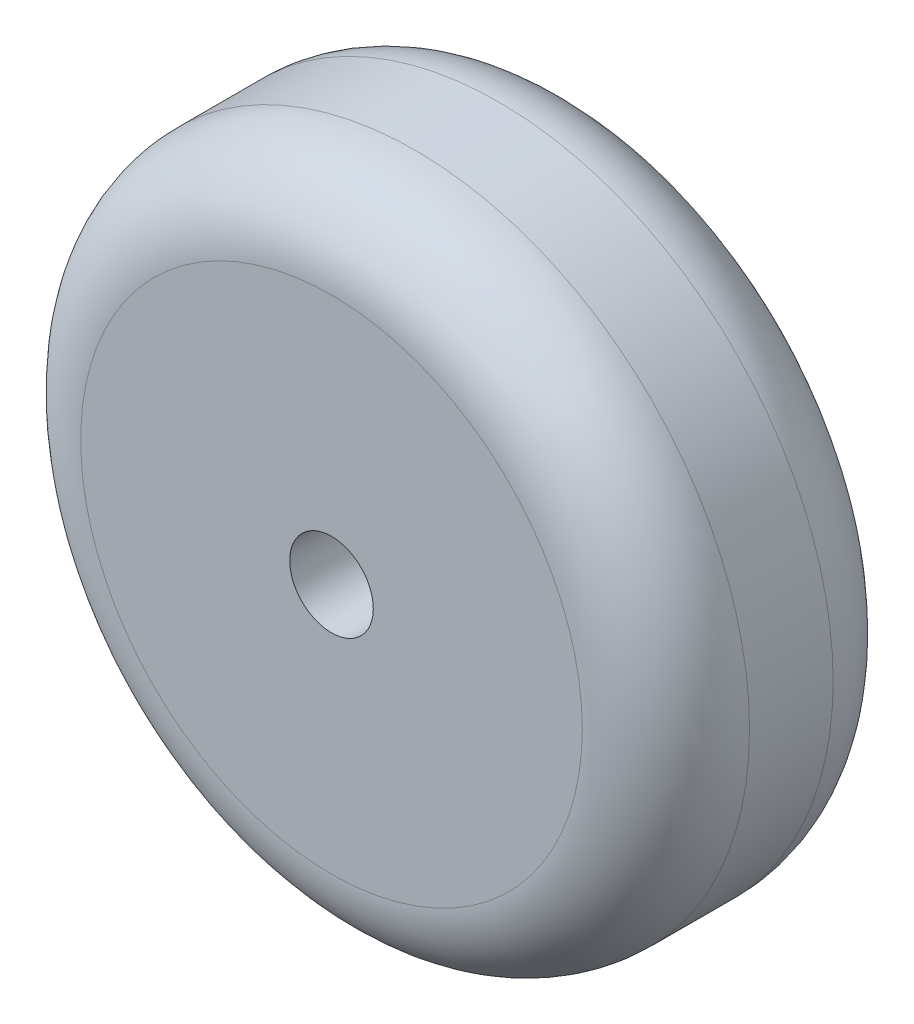
ISO-10303-21;
HEADER;
FILE_DESCRIPTION(('STEP AP214'),'2;1');
FILE_NAME('part.step','',(''),(''),'','','');
FILE_SCHEMA(('AUTOMOTIVE_DESIGN { 1 0 10303 214 1 1 1 1 }'));
ENDSEC;
DATA;
#1=APPLICATION_CONTEXT('core data for automotive mechanical design processes');
#2=APPLICATION_PROTOCOL_DEFINITION('international standard','automotive_design',2000,#1);
#3=PRODUCT_CONTEXT('',#1,'mechanical');
#4=PRODUCT('Part','Part','',(#3));
#5=PRODUCT_RELATED_PRODUCT_CATEGORY('part','',(#4));
#6=PRODUCT_DEFINITION_FORMATION('','',#4);
#7=PRODUCT_DEFINITION_CONTEXT('part definition',#1,'design');
#8=PRODUCT_DEFINITION('design','',#6,#7);
#9=PRODUCT_DEFINITION_SHAPE('','',#8);
#10=(LENGTH_UNIT() NAMED_UNIT(*) SI_UNIT(.MILLI.,.METRE.));
#11=(NAMED_UNIT(*) PLANE_ANGLE_UNIT() SI_UNIT($,.RADIAN.));
#12=(NAMED_UNIT(*) SI_UNIT($,.STERADIAN.) SOLID_ANGLE_UNIT());
#13=UNCERTAINTY_MEASURE_WITH_UNIT(LENGTH_MEASURE(1.E-05),#10,'distance_accuracy_value','');
#14=(GEOMETRIC_REPRESENTATION_CONTEXT(3) GLOBAL_UNCERTAINTY_ASSIGNED_CONTEXT((#13)) GLOBAL_UNIT_ASSIGNED_CONTEXT((#10,
#11,#12)) REPRESENTATION_CONTEXT('',''));
#15=CARTESIAN_POINT('',(0.,0.,0.));
#16=DIRECTION('',(0.,0.,1.));
#17=DIRECTION('',(1.,0.,0.));
#18=AXIS2_PLACEMENT_3D('',#15,#16,#17);
#19=CARTESIAN_POINT('',(0.,0.,30.));
#20=DIRECTION('',(0.,0.,-1.));
#21=DIRECTION('',(-1.,0.,0.));
#22=AXIS2_PLACEMENT_3D('',#19,#20,#21);
#23=CYLINDRICAL_SURFACE('',#22,40.);
#24=CARTESIAN_POINT('',(0.,0.,10.));
#25=DIRECTION('',(0.,0.,1.));
#26=DIRECTION('',(1.,0.,0.));
#27=AXIS2_PLACEMENT_3D('',#24,#25,#26);
#28=CIRCLE('',#27,40.);
#29=CARTESIAN_POINT('',(40.,0.,10.));
#30=VERTEX_POINT('',#29);
#31=EDGE_CURVE('E42',#30,#30,#28,.T.);
#32=ORIENTED_EDGE('',*,*,#31,.T.);
#33=EDGE_LOOP('',(#32));
#34=FACE_BOUND('',#33,.T.);
#35=CARTESIAN_POINT('',(0.,0.,20.));
#36=DIRECTION('',(0.,0.,1.));
#37=DIRECTION('',(1.,0.,0.));
#38=AXIS2_PLACEMENT_3D('',#35,#36,#37);
#39=CIRCLE('',#38,40.);
#40=CARTESIAN_POINT('',(40.,0.,20.));
#41=VERTEX_POINT('',#40);
#42=EDGE_CURVE('E46',#41,#41,#39,.F.);
#43=ORIENTED_EDGE('',*,*,#42,.T.);
#44=EDGE_LOOP('',(#43));
#45=FACE_BOUND('',#44,.T.);
#46=ADVANCED_FACE('F31',(#34,#45),#23,.T.);
#47=CARTESIAN_POINT('',(0.,0.,30.));
#48=DIRECTION('',(0.,0.,1.));
#49=DIRECTION('',(1.,0.,0.));
#50=AXIS2_PLACEMENT_3D('',#47,#48,#49);
#51=PLANE('',#50);
#52=CARTESIAN_POINT('',(0.,0.,30.));
#53=DIRECTION('',(0.,0.,1.));
#54=DIRECTION('',(1.,0.,0.));
#55=AXIS2_PLACEMENT_3D('',#52,#53,#54);
#56=CIRCLE('',#55,5.);
#57=CARTESIAN_POINT('',(5.,0.,30.));
#58=VERTEX_POINT('',#57);
#59=EDGE_CURVE('E51',#58,#58,#56,.T.);
#60=ORIENTED_EDGE('',*,*,#59,.F.);
#61=EDGE_LOOP('',(#60));
#62=FACE_BOUND('',#61,.T.);
#63=CARTESIAN_POINT('',(0.,0.,30.));
#64=DIRECTION('',(0.,0.,1.));
#65=DIRECTION('',(1.,0.,0.));
#66=AXIS2_PLACEMENT_3D('',#63,#64,#65);
#67=CIRCLE('',#66,30.);
#68=CARTESIAN_POINT('',(30.,0.,30.));
#69=VERTEX_POINT('',#68);
#70=EDGE_CURVE('E10',#69,#69,#67,.T.);
#71=ORIENTED_EDGE('',*,*,#70,.T.);
#72=EDGE_LOOP('',(#71));
#73=FACE_BOUND('',#72,.T.);
#74=ADVANCED_FACE('F71',(#62,#73),#51,.T.);
#75=CARTESIAN_POINT('',(0.,0.,0.));
#76=DIRECTION('',(0.,0.,1.));
#77=DIRECTION('',(1.,0.,0.));
#78=AXIS2_PLACEMENT_3D('',#75,#76,#77);
#79=PLANE('',#78);
#80=CARTESIAN_POINT('',(0.,0.,0.));
#81=DIRECTION('',(0.,0.,1.));
#82=DIRECTION('',(1.,0.,0.));
#83=AXIS2_PLACEMENT_3D('',#80,#81,#82);
#84=CIRCLE('',#83,5.);
#85=CARTESIAN_POINT('',(5.,0.,0.));
#86=VERTEX_POINT('',#85);
#87=EDGE_CURVE('E54',#86,#86,#84,.T.);
#88=ORIENTED_EDGE('',*,*,#87,.T.);
#89=EDGE_LOOP('',(#88));
#90=FACE_BOUND('',#89,.T.);
#91=CARTESIAN_POINT('',(0.,0.,0.));
#92=DIRECTION('',(0.,0.,1.));
#93=DIRECTION('',(1.,0.,0.));
#94=AXIS2_PLACEMENT_3D('',#91,#92,#93);
#95=CIRCLE('',#94,30.);
#96=CARTESIAN_POINT('',(30.,0.,0.));
#97=VERTEX_POINT('',#96);
#98=EDGE_CURVE('E38',#97,#97,#95,.F.);
#99=ORIENTED_EDGE('',*,*,#98,.T.);
#100=EDGE_LOOP('',(#99));
#101=FACE_BOUND('',#100,.T.);
#102=ADVANCED_FACE('F58',(#90,#101),#79,.F.);
#103=CARTESIAN_POINT('',(0.,0.,10.));
#104=DIRECTION('',(0.,0.,1.));
#105=DIRECTION('',(1.,0.,0.));
#106=AXIS2_PLACEMENT_3D('',#103,#104,#105);
#107=TOROIDAL_SURFACE('',#106,30.,10.);
#108=ORIENTED_EDGE('',*,*,#98,.F.);
#109=EDGE_LOOP('',(#108));
#110=FACE_BOUND('',#109,.T.);
#111=ORIENTED_EDGE('',*,*,#31,.F.);
#112=EDGE_LOOP('',(#111));
#113=FACE_BOUND('',#112,.T.);
#114=ADVANCED_FACE('F67',(#110,#113),#107,.T.);
#115=CARTESIAN_POINT('',(0.,0.,20.));
#116=DIRECTION('',(0.,0.,1.));
#117=DIRECTION('',(1.,0.,0.));
#118=AXIS2_PLACEMENT_3D('',#115,#116,#117);
#119=TOROIDAL_SURFACE('',#118,30.,10.);
#120=ORIENTED_EDGE('',*,*,#42,.F.);
#121=EDGE_LOOP('',(#120));
#122=FACE_BOUND('',#121,.T.);
#123=ORIENTED_EDGE('',*,*,#70,.F.);
#124=EDGE_LOOP('',(#123));
#125=FACE_BOUND('',#124,.T.);
#126=ADVANCED_FACE('F33',(#122,#125),#119,.T.);
#127=CARTESIAN_POINT('',(0.,0.,0.));
#128=DIRECTION('',(0.,0.,1.));
#129=DIRECTION('',(1.,0.,0.));
#130=AXIS2_PLACEMENT_3D('',#127,#128,#129);
#131=CYLINDRICAL_SURFACE('',#130,5.);
#132=ORIENTED_EDGE('',*,*,#59,.T.);
#133=EDGE_LOOP('',(#132));
#134=FACE_BOUND('',#133,.T.);
#135=ORIENTED_EDGE('',*,*,#87,.F.);
#136=EDGE_LOOP('',(#135));
#137=FACE_BOUND('',#136,.T.);
#138=ADVANCED_FACE('F60',(#134,#137),#131,.F.);
#139=CLOSED_SHELL('',(#46,#74,#102,#114,#126,#138));
#140=MANIFOLD_SOLID_BREP('B2',#139);
#141=ADVANCED_BREP_SHAPE_REPRESENTATION('',(#18,#140),#14);
#142=SHAPE_DEFINITION_REPRESENTATION(#9,#141);
ENDSEC;
END-ISO-10303-21;
